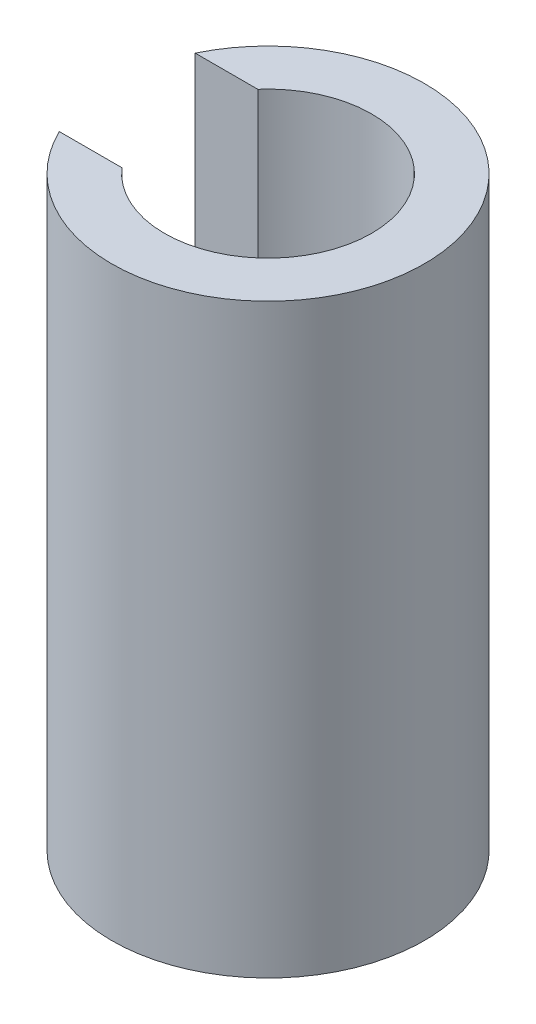
ISO-10303-21;
HEADER;
FILE_DESCRIPTION(('STEP AP214'),'2;1');
FILE_NAME('part.step','',(''),(''),'','','');
FILE_SCHEMA(('AUTOMOTIVE_DESIGN { 1 0 10303 214 1 1 1 1 }'));
ENDSEC;
DATA;
#1=APPLICATION_CONTEXT('core data for automotive mechanical design processes');
#2=APPLICATION_PROTOCOL_DEFINITION('international standard','automotive_design',2000,#1);
#3=PRODUCT_CONTEXT('',#1,'mechanical');
#4=PRODUCT('Part','Part','',(#3));
#5=PRODUCT_RELATED_PRODUCT_CATEGORY('part','',(#4));
#6=PRODUCT_DEFINITION_FORMATION('','',#4);
#7=PRODUCT_DEFINITION_CONTEXT('part definition',#1,'design');
#8=PRODUCT_DEFINITION('design','',#6,#7);
#9=PRODUCT_DEFINITION_SHAPE('','',#8);
#10=(LENGTH_UNIT() NAMED_UNIT(*) SI_UNIT(.MILLI.,.METRE.));
#11=(NAMED_UNIT(*) PLANE_ANGLE_UNIT() SI_UNIT($,.RADIAN.));
#12=(NAMED_UNIT(*) SI_UNIT($,.STERADIAN.) SOLID_ANGLE_UNIT());
#13=UNCERTAINTY_MEASURE_WITH_UNIT(LENGTH_MEASURE(1.E-05),#10,'distance_accuracy_value','');
#14=(GEOMETRIC_REPRESENTATION_CONTEXT(3) GLOBAL_UNCERTAINTY_ASSIGNED_CONTEXT((#13)) GLOBAL_UNIT_ASSIGNED_CONTEXT((#10,
#11,#12)) REPRESENTATION_CONTEXT('',''));
#15=CARTESIAN_POINT('',(0.,0.,0.));
#16=DIRECTION('',(0.,0.,1.));
#17=DIRECTION('',(1.,0.,0.));
#18=AXIS2_PLACEMENT_3D('',#15,#16,#17);
#19=CARTESIAN_POINT('',(0.,15.,0.));
#20=DIRECTION('',(0.,1.,0.));
#21=DIRECTION('',(0.,0.,1.));
#22=AXIS2_PLACEMENT_3D('',#19,#20,#21);
#23=PLANE('',#22);
#24=DIRECTION('',(-1.,0.,0.));
#25=VECTOR('',#24,1.);
#26=CARTESIAN_POINT('',(-4.,15.,-1.73853386507137));
#27=LINE('',#26,#25);
#28=CARTESIAN_POINT('',(-2.,15.,-1.73853386507137));
#29=VERTEX_POINT('',#28);
#30=CARTESIAN_POINT('',(-3.60242973560901,15.,-1.73853386507137));
#31=VERTEX_POINT('',#30);
#32=EDGE_CURVE('E97',#29,#31,#27,.T.);
#33=ORIENTED_EDGE('',*,*,#32,.F.);
#34=CARTESIAN_POINT('',(0.,15.,0.));
#35=DIRECTION('',(0.,1.,0.));
#36=DIRECTION('',(0.,0.,1.));
#37=AXIS2_PLACEMENT_3D('',#34,#35,#36);
#38=CIRCLE('',#37,2.65);
#39=CARTESIAN_POINT('',(-2.,15.,1.73853386507137));
#40=VERTEX_POINT('',#39);
#41=EDGE_CURVE('E101',#40,#29,#38,.T.);
#42=ORIENTED_EDGE('',*,*,#41,.F.);
#43=DIRECTION('',(1.,0.,0.));
#44=VECTOR('',#43,1.);
#45=CARTESIAN_POINT('',(-4.,15.,1.73853386507137));
#46=LINE('',#45,#44);
#47=CARTESIAN_POINT('',(-3.60242973560901,15.,1.73853386507137));
#48=VERTEX_POINT('',#47);
#49=EDGE_CURVE('E63',#48,#40,#46,.T.);
#50=ORIENTED_EDGE('',*,*,#49,.F.);
#51=CARTESIAN_POINT('',(0.,15.,0.));
#52=DIRECTION('',(0.,1.,0.));
#53=DIRECTION('',(0.,0.,1.));
#54=AXIS2_PLACEMENT_3D('',#51,#52,#53);
#55=CIRCLE('',#54,4.);
#56=EDGE_CURVE('E11',#48,#31,#55,.T.);
#57=ORIENTED_EDGE('',*,*,#56,.T.);
#58=EDGE_LOOP('',(#33,#42,#50,#57));
#59=FACE_BOUND('',#58,.T.);
#60=ADVANCED_FACE('F39',(#59),#23,.T.);
#61=CARTESIAN_POINT('',(0.,0.,0.));
#62=DIRECTION('',(0.,1.,0.));
#63=DIRECTION('',(0.,0.,1.));
#64=AXIS2_PLACEMENT_3D('',#61,#62,#63);
#65=PLANE('',#64);
#66=CARTESIAN_POINT('',(0.,0.,0.));
#67=DIRECTION('',(0.,1.,0.));
#68=DIRECTION('',(0.,0.,1.));
#69=AXIS2_PLACEMENT_3D('',#66,#67,#68);
#70=CIRCLE('',#69,2.65);
#71=CARTESIAN_POINT('',(-2.,0.,1.73853386507137));
#72=VERTEX_POINT('',#71);
#73=CARTESIAN_POINT('',(-2.,0.,-1.73853386507137));
#74=VERTEX_POINT('',#73);
#75=EDGE_CURVE('E94',#72,#74,#70,.T.);
#76=ORIENTED_EDGE('',*,*,#75,.T.);
#77=DIRECTION('',(-1.,0.,0.));
#78=VECTOR('',#77,1.);
#79=CARTESIAN_POINT('',(-4.,0.,-1.73853386507137));
#80=LINE('',#79,#78);
#81=CARTESIAN_POINT('',(-3.60242973560901,0.,-1.73853386507137));
#82=VERTEX_POINT('',#81);
#83=EDGE_CURVE('E55',#74,#82,#80,.T.);
#84=ORIENTED_EDGE('',*,*,#83,.T.);
#85=CARTESIAN_POINT('',(0.,0.,0.));
#86=DIRECTION('',(0.,1.,0.));
#87=DIRECTION('',(0.,0.,1.));
#88=AXIS2_PLACEMENT_3D('',#85,#86,#87);
#89=CIRCLE('',#88,4.);
#90=CARTESIAN_POINT('',(-3.60242973560901,0.,1.73853386507137));
#91=VERTEX_POINT('',#90);
#92=EDGE_CURVE('E43',#91,#82,#89,.T.);
#93=ORIENTED_EDGE('',*,*,#92,.F.);
#94=DIRECTION('',(1.,0.,0.));
#95=VECTOR('',#94,1.);
#96=CARTESIAN_POINT('',(-4.,0.,1.73853386507137));
#97=LINE('',#96,#95);
#98=EDGE_CURVE('E81',#91,#72,#97,.T.);
#99=ORIENTED_EDGE('',*,*,#98,.T.);
#100=EDGE_LOOP('',(#76,#84,#93,#99));
#101=FACE_BOUND('',#100,.T.);
#102=ADVANCED_FACE('F93',(#101),#65,.F.);
#103=CARTESIAN_POINT('',(0.,15.,0.));
#104=DIRECTION('',(0.,-1.,0.));
#105=DIRECTION('',(0.,0.,-1.));
#106=AXIS2_PLACEMENT_3D('',#103,#104,#105);
#107=CYLINDRICAL_SURFACE('',#106,4.);
#108=ORIENTED_EDGE('',*,*,#92,.T.);
#109=DIRECTION('',(0.,-1.,0.));
#110=VECTOR('',#109,1.);
#111=CARTESIAN_POINT('',(-3.60242973560901,15.,-1.73853386507137));
#112=LINE('',#111,#110);
#113=EDGE_CURVE('E102',#82,#31,#112,.F.);
#114=ORIENTED_EDGE('',*,*,#113,.T.);
#115=ORIENTED_EDGE('',*,*,#56,.F.);
#116=DIRECTION('',(0.,-1.,0.));
#117=VECTOR('',#116,1.);
#118=CARTESIAN_POINT('',(-3.60242973560901,15.,1.73853386507137));
#119=LINE('',#118,#117);
#120=EDGE_CURVE('E108',#48,#91,#119,.T.);
#121=ORIENTED_EDGE('',*,*,#120,.T.);
#122=EDGE_LOOP('',(#108,#114,#115,#121));
#123=FACE_BOUND('',#122,.T.);
#124=ADVANCED_FACE('F41',(#123),#107,.T.);
#125=CARTESIAN_POINT('',(0.,15.,0.));
#126=DIRECTION('',(0.,-1.,0.));
#127=DIRECTION('',(0.,0.,-1.));
#128=AXIS2_PLACEMENT_3D('',#125,#126,#127);
#129=CYLINDRICAL_SURFACE('',#128,2.65);
#130=DIRECTION('',(0.,1.,0.));
#131=VECTOR('',#130,1.);
#132=CARTESIAN_POINT('',(-2.,0.,-1.73853386507137));
#133=LINE('',#132,#131);
#134=EDGE_CURVE('E88',#74,#29,#133,.T.);
#135=ORIENTED_EDGE('',*,*,#134,.F.);
#136=ORIENTED_EDGE('',*,*,#75,.F.);
#137=DIRECTION('',(0.,1.,0.));
#138=VECTOR('',#137,1.);
#139=CARTESIAN_POINT('',(-2.,0.,1.73853386507137));
#140=LINE('',#139,#138);
#141=EDGE_CURVE('E78',#72,#40,#140,.T.);
#142=ORIENTED_EDGE('',*,*,#141,.T.);
#143=ORIENTED_EDGE('',*,*,#41,.T.);
#144=EDGE_LOOP('',(#135,#136,#142,#143));
#145=FACE_BOUND('',#144,.T.);
#146=ADVANCED_FACE('F99',(#145),#129,.F.);
#147=CARTESIAN_POINT('',(-4.,0.,1.73853386507137));
#148=DIRECTION('',(0.,0.,1.));
#149=DIRECTION('',(1.,0.,0.));
#150=AXIS2_PLACEMENT_3D('',#147,#148,#149);
#151=PLANE('',#150);
#152=ORIENTED_EDGE('',*,*,#49,.T.);
#153=ORIENTED_EDGE('',*,*,#141,.F.);
#154=ORIENTED_EDGE('',*,*,#98,.F.);
#155=ORIENTED_EDGE('',*,*,#120,.F.);
#156=EDGE_LOOP('',(#152,#153,#154,#155));
#157=FACE_BOUND('',#156,.T.);
#158=ADVANCED_FACE('F80',(#157),#151,.F.);
#159=CARTESIAN_POINT('',(-4.,0.,-1.73853386507137));
#160=DIRECTION('',(0.,0.,-1.));
#161=DIRECTION('',(-1.,0.,0.));
#162=AXIS2_PLACEMENT_3D('',#159,#160,#161);
#163=PLANE('',#162);
#164=ORIENTED_EDGE('',*,*,#83,.F.);
#165=ORIENTED_EDGE('',*,*,#134,.T.);
#166=ORIENTED_EDGE('',*,*,#32,.T.);
#167=ORIENTED_EDGE('',*,*,#113,.F.);
#168=EDGE_LOOP('',(#164,#165,#166,#167));
#169=FACE_BOUND('',#168,.T.);
#170=ADVANCED_FACE('F125',(#169),#163,.F.);
#171=CLOSED_SHELL('',(#60,#102,#124,#146,#158,#170));
#172=MANIFOLD_SOLID_BREP('B2',#171);
#173=ADVANCED_BREP_SHAPE_REPRESENTATION('',(#18,#172),#14);
#174=SHAPE_DEFINITION_REPRESENTATION(#9,#173);
ENDSEC;
END-ISO-10303-21;
